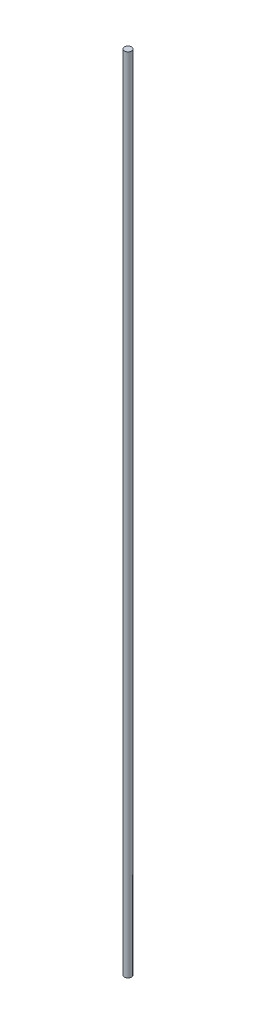
ISO-10303-21;
HEADER;
FILE_DESCRIPTION(('STEP AP214'),'2;1');
FILE_NAME('part.step','',(''),(''),'','','');
FILE_SCHEMA(('AUTOMOTIVE_DESIGN { 1 0 10303 214 1 1 1 1 }'));
ENDSEC;
DATA;
#1=APPLICATION_CONTEXT('core data for automotive mechanical design processes');
#2=APPLICATION_PROTOCOL_DEFINITION('international standard','automotive_design',2000,#1);
#3=PRODUCT_CONTEXT('',#1,'mechanical');
#4=PRODUCT('Part','Part','',(#3));
#5=PRODUCT_RELATED_PRODUCT_CATEGORY('part','',(#4));
#6=PRODUCT_DEFINITION_FORMATION('','',#4);
#7=PRODUCT_DEFINITION_CONTEXT('part definition',#1,'design');
#8=PRODUCT_DEFINITION('design','',#6,#7);
#9=PRODUCT_DEFINITION_SHAPE('','',#8);
#10=(LENGTH_UNIT() NAMED_UNIT(*) SI_UNIT(.MILLI.,.METRE.));
#11=(NAMED_UNIT(*) PLANE_ANGLE_UNIT() SI_UNIT($,.RADIAN.));
#12=(NAMED_UNIT(*) SI_UNIT($,.STERADIAN.) SOLID_ANGLE_UNIT());
#13=UNCERTAINTY_MEASURE_WITH_UNIT(LENGTH_MEASURE(1.E-05),#10,'distance_accuracy_value','');
#14=(GEOMETRIC_REPRESENTATION_CONTEXT(3) GLOBAL_UNCERTAINTY_ASSIGNED_CONTEXT((#13)) GLOBAL_UNIT_ASSIGNED_CONTEXT((#10,
#11,#12)) REPRESENTATION_CONTEXT('',''));
#15=CARTESIAN_POINT('',(0.,0.,0.));
#16=DIRECTION('',(0.,0.,1.));
#17=DIRECTION('',(1.,0.,0.));
#18=AXIS2_PLACEMENT_3D('',#15,#16,#17);
#19=CARTESIAN_POINT('',(0.,889.,0.));
#20=DIRECTION('',(0.,-1.,0.));
#21=DIRECTION('',(0.,0.,-1.));
#22=AXIS2_PLACEMENT_3D('',#19,#20,#21);
#23=CYLINDRICAL_SURFACE('',#22,4.0005);
#24=CARTESIAN_POINT('',(0.,889.,0.));
#25=DIRECTION('',(0.,1.,0.));
#26=DIRECTION('',(0.,0.,1.));
#27=AXIS2_PLACEMENT_3D('',#24,#25,#26);
#28=CIRCLE('',#27,4.0005);
#29=CARTESIAN_POINT('',(0.,889.,4.0005));
#30=VERTEX_POINT('',#29);
#31=EDGE_CURVE('E10',#30,#30,#28,.T.);
#32=ORIENTED_EDGE('',*,*,#31,.F.);
#33=EDGE_LOOP('',(#32));
#34=FACE_BOUND('',#33,.T.);
#35=CARTESIAN_POINT('',(0.,0.,0.));
#36=DIRECTION('',(0.,1.,0.));
#37=DIRECTION('',(0.,0.,1.));
#38=AXIS2_PLACEMENT_3D('',#35,#36,#37);
#39=CIRCLE('',#38,4.0005);
#40=CARTESIAN_POINT('',(0.,0.,4.0005));
#41=VERTEX_POINT('',#40);
#42=EDGE_CURVE('E33',#41,#41,#39,.T.);
#43=ORIENTED_EDGE('',*,*,#42,.T.);
#44=EDGE_LOOP('',(#43));
#45=FACE_BOUND('',#44,.T.);
#46=ADVANCED_FACE('F30',(#34,#45),#23,.T.);
#47=CARTESIAN_POINT('',(0.,889.,0.));
#48=DIRECTION('',(0.,1.,0.));
#49=DIRECTION('',(0.,0.,1.));
#50=AXIS2_PLACEMENT_3D('',#47,#48,#49);
#51=PLANE('',#50);
#52=ORIENTED_EDGE('',*,*,#31,.T.);
#53=EDGE_LOOP('',(#52));
#54=FACE_BOUND('',#53,.T.);
#55=ADVANCED_FACE('F45',(#54),#51,.T.);
#56=CARTESIAN_POINT('',(0.,0.,0.));
#57=DIRECTION('',(0.,1.,0.));
#58=DIRECTION('',(0.,0.,1.));
#59=AXIS2_PLACEMENT_3D('',#56,#57,#58);
#60=PLANE('',#59);
#61=ORIENTED_EDGE('',*,*,#42,.F.);
#62=EDGE_LOOP('',(#61));
#63=FACE_BOUND('',#62,.T.);
#64=ADVANCED_FACE('F43',(#63),#60,.F.);
#65=CLOSED_SHELL('',(#46,#55,#64));
#66=MANIFOLD_SOLID_BREP('B2',#65);
#67=ADVANCED_BREP_SHAPE_REPRESENTATION('',(#18,#66),#14);
#68=SHAPE_DEFINITION_REPRESENTATION(#9,#67);
ENDSEC;
END-ISO-10303-21;
